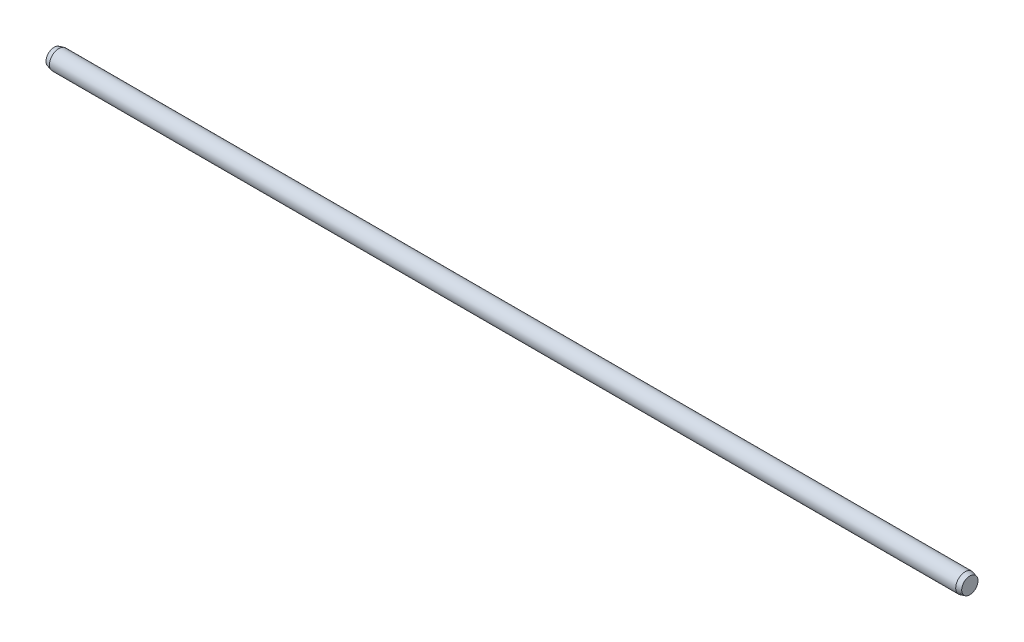
ISO-10303-21;
HEADER;
FILE_DESCRIPTION(('STEP AP214'),'2;1');
FILE_NAME('part.step','',(''),(''),'','','');
FILE_SCHEMA(('AUTOMOTIVE_DESIGN { 1 0 10303 214 1 1 1 1 }'));
ENDSEC;
DATA;
#1=APPLICATION_CONTEXT('core data for automotive mechanical design processes');
#2=APPLICATION_PROTOCOL_DEFINITION('international standard','automotive_design',2000,#1);
#3=PRODUCT_CONTEXT('',#1,'mechanical');
#4=PRODUCT('Part','Part','',(#3));
#5=PRODUCT_RELATED_PRODUCT_CATEGORY('part','',(#4));
#6=PRODUCT_DEFINITION_FORMATION('','',#4);
#7=PRODUCT_DEFINITION_CONTEXT('part definition',#1,'design');
#8=PRODUCT_DEFINITION('design','',#6,#7);
#9=PRODUCT_DEFINITION_SHAPE('','',#8);
#10=(LENGTH_UNIT() NAMED_UNIT(*) SI_UNIT(.MILLI.,.METRE.));
#11=(NAMED_UNIT(*) PLANE_ANGLE_UNIT() SI_UNIT($,.RADIAN.));
#12=(NAMED_UNIT(*) SI_UNIT($,.STERADIAN.) SOLID_ANGLE_UNIT());
#13=UNCERTAINTY_MEASURE_WITH_UNIT(LENGTH_MEASURE(1.E-05),#10,'distance_accuracy_value','');
#14=(GEOMETRIC_REPRESENTATION_CONTEXT(3) GLOBAL_UNCERTAINTY_ASSIGNED_CONTEXT((#13)) GLOBAL_UNIT_ASSIGNED_CONTEXT((#10,
#11,#12)) REPRESENTATION_CONTEXT('',''));
#15=CARTESIAN_POINT('',(0.,0.,0.));
#16=DIRECTION('',(0.,0.,1.));
#17=DIRECTION('',(1.,0.,0.));
#18=AXIS2_PLACEMENT_3D('',#15,#16,#17);
#19=CARTESIAN_POINT('',(194.5,0.,0.));
#20=DIRECTION('',(-1.,0.,0.));
#21=DIRECTION('',(0.,0.,1.));
#22=AXIS2_PLACEMENT_3D('',#19,#20,#21);
#23=CYLINDRICAL_SURFACE('',#22,4.);
#24=CARTESIAN_POINT('',(-192.5,0.,0.));
#25=DIRECTION('',(1.,0.,0.));
#26=DIRECTION('',(0.,0.,-1.));
#27=AXIS2_PLACEMENT_3D('',#24,#25,#26);
#28=CIRCLE('',#27,4.);
#29=CARTESIAN_POINT('',(-192.5,0.,-4.));
#30=VERTEX_POINT('',#29);
#31=EDGE_CURVE('E39',#30,#30,#28,.T.);
#32=ORIENTED_EDGE('',*,*,#31,.T.);
#33=EDGE_LOOP('',(#32));
#34=FACE_BOUND('',#33,.T.);
#35=CARTESIAN_POINT('',(192.5,0.,0.));
#36=DIRECTION('',(1.,0.,0.));
#37=DIRECTION('',(0.,0.,-1.));
#38=AXIS2_PLACEMENT_3D('',#35,#36,#37);
#39=CIRCLE('',#38,4.);
#40=CARTESIAN_POINT('',(192.5,0.,-4.));
#41=VERTEX_POINT('',#40);
#42=EDGE_CURVE('E43',#41,#41,#39,.F.);
#43=ORIENTED_EDGE('',*,*,#42,.T.);
#44=EDGE_LOOP('',(#43));
#45=FACE_BOUND('',#44,.T.);
#46=ADVANCED_FACE('F32',(#34,#45),#23,.T.);
#47=CARTESIAN_POINT('',(194.5,0.,0.));
#48=DIRECTION('',(1.,0.,0.));
#49=DIRECTION('',(0.,0.,-1.));
#50=AXIS2_PLACEMENT_3D('',#47,#48,#49);
#51=PLANE('',#50);
#52=CARTESIAN_POINT('',(194.5,0.,0.));
#53=DIRECTION('',(1.,0.,0.));
#54=DIRECTION('',(0.,0.,-1.));
#55=AXIS2_PLACEMENT_3D('',#52,#53,#54);
#56=CIRCLE('',#55,3.46410161513766);
#57=CARTESIAN_POINT('',(194.5,0.,-3.46410161513766));
#58=VERTEX_POINT('',#57);
#59=EDGE_CURVE('E47',#58,#58,#56,.T.);
#60=ORIENTED_EDGE('',*,*,#59,.T.);
#61=EDGE_LOOP('',(#60));
#62=FACE_BOUND('',#61,.T.);
#63=ADVANCED_FACE('F53',(#62),#51,.T.);
#64=CARTESIAN_POINT('',(-194.5,0.,0.));
#65=DIRECTION('',(1.,0.,0.));
#66=DIRECTION('',(0.,0.,-1.));
#67=AXIS2_PLACEMENT_3D('',#64,#65,#66);
#68=PLANE('',#67);
#69=CARTESIAN_POINT('',(-194.5,0.,0.));
#70=DIRECTION('',(1.,0.,0.));
#71=DIRECTION('',(0.,0.,-1.));
#72=AXIS2_PLACEMENT_3D('',#69,#70,#71);
#73=CIRCLE('',#72,3.46410161513774);
#74=CARTESIAN_POINT('',(-194.5,0.,-3.46410161513774));
#75=VERTEX_POINT('',#74);
#76=EDGE_CURVE('E10',#75,#75,#73,.F.);
#77=ORIENTED_EDGE('',*,*,#76,.T.);
#78=EDGE_LOOP('',(#77));
#79=FACE_BOUND('',#78,.T.);
#80=ADVANCED_FACE('F57',(#79),#68,.F.);
#81=CARTESIAN_POINT('',(194.5,0.,0.));
#82=DIRECTION('',(-1.,0.,0.));
#83=DIRECTION('',(0.,0.,1.));
#84=AXIS2_PLACEMENT_3D('',#81,#82,#83);
#85=CONICAL_SURFACE('',#84,3.46410161513766,0.261799387799148);
#86=ORIENTED_EDGE('',*,*,#42,.F.);
#87=EDGE_LOOP('',(#86));
#88=FACE_BOUND('',#87,.T.);
#89=ORIENTED_EDGE('',*,*,#59,.F.);
#90=EDGE_LOOP('',(#89));
#91=FACE_BOUND('',#90,.T.);
#92=ADVANCED_FACE('F55',(#88,#91),#85,.T.);
#93=CARTESIAN_POINT('',(-192.5,0.,0.));
#94=DIRECTION('',(1.,0.,0.));
#95=DIRECTION('',(0.,0.,-1.));
#96=AXIS2_PLACEMENT_3D('',#93,#94,#95);
#97=CONICAL_SURFACE('',#96,4.,0.261799387799141);
#98=ORIENTED_EDGE('',*,*,#76,.F.);
#99=EDGE_LOOP('',(#98));
#100=FACE_BOUND('',#99,.T.);
#101=ORIENTED_EDGE('',*,*,#31,.F.);
#102=EDGE_LOOP('',(#101));
#103=FACE_BOUND('',#102,.T.);
#104=ADVANCED_FACE('F34',(#100,#103),#97,.T.);
#105=CLOSED_SHELL('',(#46,#63,#80,#92,#104));
#106=MANIFOLD_SOLID_BREP('B2',#105);
#107=ADVANCED_BREP_SHAPE_REPRESENTATION('',(#18,#106),#14);
#108=SHAPE_DEFINITION_REPRESENTATION(#9,#107);
ENDSEC;
END-ISO-10303-21;
